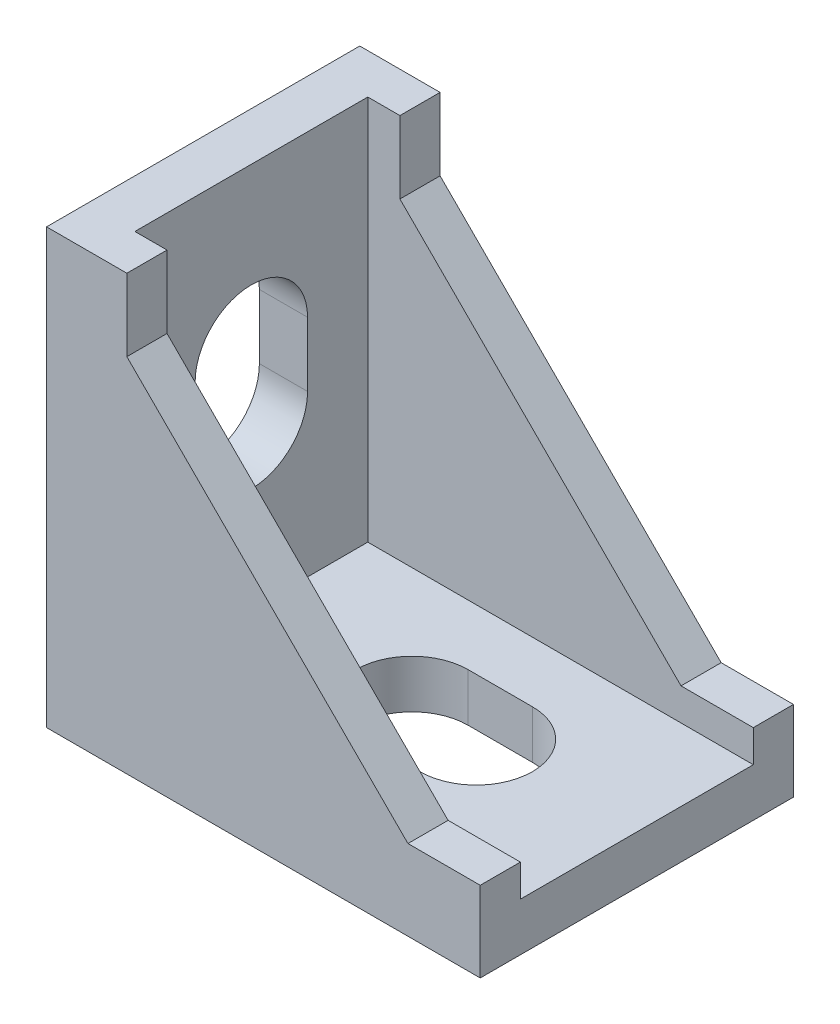
ISO-10303-21;
HEADER;
FILE_DESCRIPTION(('STEP AP214'),'2;1');
FILE_NAME('part.step','',(''),(''),'','','');
FILE_SCHEMA(('AUTOMOTIVE_DESIGN { 1 0 10303 214 1 1 1 1 }'));
ENDSEC;
DATA;
#1=APPLICATION_CONTEXT('core data for automotive mechanical design processes');
#2=APPLICATION_PROTOCOL_DEFINITION('international standard','automotive_design',2000,#1);
#3=PRODUCT_CONTEXT('',#1,'mechanical');
#4=PRODUCT('Part','Part','',(#3));
#5=PRODUCT_RELATED_PRODUCT_CATEGORY('part','',(#4));
#6=PRODUCT_DEFINITION_FORMATION('','',#4);
#7=PRODUCT_DEFINITION_CONTEXT('part definition',#1,'design');
#8=PRODUCT_DEFINITION('design','',#6,#7);
#9=PRODUCT_DEFINITION_SHAPE('','',#8);
#10=(LENGTH_UNIT() NAMED_UNIT(*) SI_UNIT(.MILLI.,.METRE.));
#11=(NAMED_UNIT(*) PLANE_ANGLE_UNIT() SI_UNIT($,.RADIAN.));
#12=(NAMED_UNIT(*) SI_UNIT($,.STERADIAN.) SOLID_ANGLE_UNIT());
#13=UNCERTAINTY_MEASURE_WITH_UNIT(LENGTH_MEASURE(1.E-05),#10,'distance_accuracy_value','');
#14=(GEOMETRIC_REPRESENTATION_CONTEXT(3) GLOBAL_UNCERTAINTY_ASSIGNED_CONTEXT((#13)) GLOBAL_UNIT_ASSIGNED_CONTEXT((#10,
#11,#12)) REPRESENTATION_CONTEXT('',''));
#15=CARTESIAN_POINT('',(0.,0.,0.));
#16=DIRECTION('',(0.,0.,1.));
#17=DIRECTION('',(1.,0.,0.));
#18=AXIS2_PLACEMENT_3D('',#15,#16,#17);
#19=CARTESIAN_POINT('',(27.,5.,19.5));
#20=DIRECTION('',(-1.,0.,0.));
#21=DIRECTION('',(0.,0.,1.));
#22=AXIS2_PLACEMENT_3D('',#19,#20,#21);
#23=PLANE('',#22);
#24=DIRECTION('',(0.,1.,0.));
#25=VECTOR('',#24,1.);
#26=CARTESIAN_POINT('',(27.,3.,2.5));
#27=LINE('',#26,#25);
#28=CARTESIAN_POINT('',(27.,3.,2.5));
#29=VERTEX_POINT('',#28);
#30=CARTESIAN_POINT('',(27.,5.,2.5));
#31=VERTEX_POINT('',#30);
#32=EDGE_CURVE('E259',#29,#31,#27,.T.);
#33=ORIENTED_EDGE('',*,*,#32,.F.);
#34=DIRECTION('',(0.,0.,1.));
#35=VECTOR('',#34,1.);
#36=CARTESIAN_POINT('',(27.,3.,2.5));
#37=LINE('',#36,#35);
#38=CARTESIAN_POINT('',(27.,3.,17.));
#39=VERTEX_POINT('',#38);
#40=EDGE_CURVE('E294',#29,#39,#37,.T.);
#41=ORIENTED_EDGE('',*,*,#40,.T.);
#42=DIRECTION('',(0.,1.,0.));
#43=VECTOR('',#42,1.);
#44=CARTESIAN_POINT('',(27.,3.,17.));
#45=LINE('',#44,#43);
#46=CARTESIAN_POINT('',(27.,5.,17.));
#47=VERTEX_POINT('',#46);
#48=EDGE_CURVE('E276',#39,#47,#45,.T.);
#49=ORIENTED_EDGE('',*,*,#48,.T.);
#50=DIRECTION('',(0.,0.,-1.));
#51=VECTOR('',#50,1.);
#52=CARTESIAN_POINT('',(27.,5.,19.5));
#53=LINE('',#52,#51);
#54=CARTESIAN_POINT('',(27.,5.,19.5));
#55=VERTEX_POINT('',#54);
#56=EDGE_CURVE('E42',#55,#47,#53,.T.);
#57=ORIENTED_EDGE('',*,*,#56,.F.);
#58=DIRECTION('',(0.,1.,0.));
#59=VECTOR('',#58,1.);
#60=CARTESIAN_POINT('',(27.,5.,19.5));
#61=LINE('',#60,#59);
#62=CARTESIAN_POINT('',(27.,0.,19.5));
#63=VERTEX_POINT('',#62);
#64=EDGE_CURVE('E301',#63,#55,#61,.T.);
#65=ORIENTED_EDGE('',*,*,#64,.F.);
#66=DIRECTION('',(0.,0.,-1.));
#67=VECTOR('',#66,1.);
#68=CARTESIAN_POINT('',(27.,0.,19.5));
#69=LINE('',#68,#67);
#70=CARTESIAN_POINT('',(27.,0.,0.));
#71=VERTEX_POINT('',#70);
#72=EDGE_CURVE('E11',#63,#71,#69,.T.);
#73=ORIENTED_EDGE('',*,*,#72,.T.);
#74=DIRECTION('',(0.,1.,0.));
#75=VECTOR('',#74,1.);
#76=CARTESIAN_POINT('',(27.,5.,0.));
#77=LINE('',#76,#75);
#78=CARTESIAN_POINT('',(27.,5.,0.));
#79=VERTEX_POINT('',#78);
#80=EDGE_CURVE('E317',#71,#79,#77,.T.);
#81=ORIENTED_EDGE('',*,*,#80,.T.);
#82=EDGE_CURVE('E348',#31,#79,#53,.T.);
#83=ORIENTED_EDGE('',*,*,#82,.F.);
#84=EDGE_LOOP('',(#33,#41,#49,#57,#65,#73,#81,#83));
#85=FACE_BOUND('',#84,.T.);
#86=ADVANCED_FACE('F34',(#85),#23,.F.);
#87=CARTESIAN_POINT('',(22.5,5.,19.5));
#88=DIRECTION('',(0.,-1.,0.));
#89=DIRECTION('',(0.,0.,-1.));
#90=AXIS2_PLACEMENT_3D('',#87,#88,#89);
#91=PLANE('',#90);
#92=DIRECTION('',(-1.,0.,0.));
#93=VECTOR('',#92,1.);
#94=CARTESIAN_POINT('',(22.5,5.,2.5));
#95=LINE('',#94,#93);
#96=CARTESIAN_POINT('',(22.5,5.,2.5));
#97=VERTEX_POINT('',#96);
#98=EDGE_CURVE('E261',#31,#97,#95,.T.);
#99=ORIENTED_EDGE('',*,*,#98,.F.);
#100=ORIENTED_EDGE('',*,*,#82,.T.);
#101=DIRECTION('',(-1.,0.,0.));
#102=VECTOR('',#101,1.);
#103=CARTESIAN_POINT('',(22.5,5.,0.));
#104=LINE('',#103,#102);
#105=CARTESIAN_POINT('',(22.5,5.,0.));
#106=VERTEX_POINT('',#105);
#107=EDGE_CURVE('E320',#79,#106,#104,.T.);
#108=ORIENTED_EDGE('',*,*,#107,.T.);
#109=DIRECTION('',(0.,0.,-1.));
#110=VECTOR('',#109,1.);
#111=CARTESIAN_POINT('',(22.5,5.,19.5));
#112=LINE('',#111,#110);
#113=EDGE_CURVE('E345',#97,#106,#112,.T.);
#114=ORIENTED_EDGE('',*,*,#113,.F.);
#115=EDGE_LOOP('',(#99,#100,#108,#114));
#116=FACE_BOUND('',#115,.T.);
#117=ADVANCED_FACE('F356',(#116),#91,.F.);
#118=CARTESIAN_POINT('',(5.,22.5,19.5));
#119=DIRECTION('',(-0.707106781186548,-0.707106781186548,0.));
#120=DIRECTION('',(0.707106781186548,-0.707106781186548,0.));
#121=AXIS2_PLACEMENT_3D('',#118,#119,#120);
#122=PLANE('',#121);
#123=DIRECTION('',(-0.707106781186548,0.707106781186548,0.));
#124=VECTOR('',#123,1.);
#125=CARTESIAN_POINT('',(5.,22.5,2.5));
#126=LINE('',#125,#124);
#127=CARTESIAN_POINT('',(5.,22.5,2.5));
#128=VERTEX_POINT('',#127);
#129=EDGE_CURVE('E263',#97,#128,#126,.T.);
#130=ORIENTED_EDGE('',*,*,#129,.F.);
#131=ORIENTED_EDGE('',*,*,#113,.T.);
#132=DIRECTION('',(-0.707106781186548,0.707106781186548,0.));
#133=VECTOR('',#132,1.);
#134=CARTESIAN_POINT('',(5.,22.5,0.));
#135=LINE('',#134,#133);
#136=CARTESIAN_POINT('',(5.,22.5,0.));
#137=VERTEX_POINT('',#136);
#138=EDGE_CURVE('E323',#106,#137,#135,.T.);
#139=ORIENTED_EDGE('',*,*,#138,.T.);
#140=DIRECTION('',(0.,0.,-1.));
#141=VECTOR('',#140,1.);
#142=CARTESIAN_POINT('',(5.,22.5,19.5));
#143=LINE('',#142,#141);
#144=EDGE_CURVE('E341',#128,#137,#143,.T.);
#145=ORIENTED_EDGE('',*,*,#144,.F.);
#146=EDGE_LOOP('',(#130,#131,#139,#145));
#147=FACE_BOUND('',#146,.T.);
#148=ADVANCED_FACE('F371',(#147),#122,.F.);
#149=CARTESIAN_POINT('',(5.,27.,19.5));
#150=DIRECTION('',(-1.,0.,0.));
#151=DIRECTION('',(0.,-1.,0.));
#152=AXIS2_PLACEMENT_3D('',#149,#150,#151);
#153=PLANE('',#152);
#154=DIRECTION('',(0.,1.,0.));
#155=VECTOR('',#154,1.);
#156=CARTESIAN_POINT('',(5.,27.,2.5));
#157=LINE('',#156,#155);
#158=CARTESIAN_POINT('',(5.,27.,2.5));
#159=VERTEX_POINT('',#158);
#160=EDGE_CURVE('E265',#128,#159,#157,.T.);
#161=ORIENTED_EDGE('',*,*,#160,.F.);
#162=ORIENTED_EDGE('',*,*,#144,.T.);
#163=DIRECTION('',(0.,1.,0.));
#164=VECTOR('',#163,1.);
#165=CARTESIAN_POINT('',(5.,27.,0.));
#166=LINE('',#165,#164);
#167=CARTESIAN_POINT('',(5.,27.,0.));
#168=VERTEX_POINT('',#167);
#169=EDGE_CURVE('E326',#137,#168,#166,.T.);
#170=ORIENTED_EDGE('',*,*,#169,.T.);
#171=DIRECTION('',(0.,0.,-1.));
#172=VECTOR('',#171,1.);
#173=CARTESIAN_POINT('',(5.,27.,19.5));
#174=LINE('',#173,#172);
#175=EDGE_CURVE('E337',#159,#168,#174,.T.);
#176=ORIENTED_EDGE('',*,*,#175,.F.);
#177=EDGE_LOOP('',(#161,#162,#170,#176));
#178=FACE_BOUND('',#177,.T.);
#179=ADVANCED_FACE('F378',(#178),#153,.F.);
#180=CARTESIAN_POINT('',(0.,27.,19.5));
#181=DIRECTION('',(0.,-1.,0.));
#182=DIRECTION('',(0.,0.,-1.));
#183=AXIS2_PLACEMENT_3D('',#180,#181,#182);
#184=PLANE('',#183);
#185=DIRECTION('',(-1.,0.,0.));
#186=VECTOR('',#185,1.);
#187=CARTESIAN_POINT('',(3.,27.,2.5));
#188=LINE('',#187,#186);
#189=CARTESIAN_POINT('',(3.,27.,2.5));
#190=VERTEX_POINT('',#189);
#191=EDGE_CURVE('E267',#159,#190,#188,.T.);
#192=ORIENTED_EDGE('',*,*,#191,.F.);
#193=ORIENTED_EDGE('',*,*,#175,.T.);
#194=DIRECTION('',(-1.,0.,0.));
#195=VECTOR('',#194,1.);
#196=CARTESIAN_POINT('',(0.,27.,0.));
#197=LINE('',#196,#195);
#198=CARTESIAN_POINT('',(0.,27.,0.));
#199=VERTEX_POINT('',#198);
#200=EDGE_CURVE('E329',#168,#199,#197,.T.);
#201=ORIENTED_EDGE('',*,*,#200,.T.);
#202=DIRECTION('',(0.,0.,-1.));
#203=VECTOR('',#202,1.);
#204=CARTESIAN_POINT('',(0.,27.,19.5));
#205=LINE('',#204,#203);
#206=CARTESIAN_POINT('',(0.,27.,19.5));
#207=VERTEX_POINT('',#206);
#208=EDGE_CURVE('E334',#207,#199,#205,.T.);
#209=ORIENTED_EDGE('',*,*,#208,.F.);
#210=DIRECTION('',(-1.,0.,0.));
#211=VECTOR('',#210,1.);
#212=CARTESIAN_POINT('',(0.,27.,19.5));
#213=LINE('',#212,#211);
#214=CARTESIAN_POINT('',(5.,27.,19.5));
#215=VERTEX_POINT('',#214);
#216=EDGE_CURVE('E310',#215,#207,#213,.T.);
#217=ORIENTED_EDGE('',*,*,#216,.F.);
#218=CARTESIAN_POINT('',(5.,27.,17.));
#219=VERTEX_POINT('',#218);
#220=EDGE_CURVE('E338',#215,#219,#174,.T.);
#221=ORIENTED_EDGE('',*,*,#220,.T.);
#222=DIRECTION('',(-1.,0.,0.));
#223=VECTOR('',#222,1.);
#224=CARTESIAN_POINT('',(3.,27.,17.));
#225=LINE('',#224,#223);
#226=CARTESIAN_POINT('',(3.,27.,17.));
#227=VERTEX_POINT('',#226);
#228=EDGE_CURVE('E256',#219,#227,#225,.T.);
#229=ORIENTED_EDGE('',*,*,#228,.T.);
#230=DIRECTION('',(0.,0.,1.));
#231=VECTOR('',#230,1.);
#232=CARTESIAN_POINT('',(3.,27.,2.5));
#233=LINE('',#232,#231);
#234=EDGE_CURVE('E290',#190,#227,#233,.T.);
#235=ORIENTED_EDGE('',*,*,#234,.F.);
#236=EDGE_LOOP('',(#192,#193,#201,#209,#217,#221,#229,#235));
#237=FACE_BOUND('',#236,.T.);
#238=ADVANCED_FACE('F380',(#237),#184,.F.);
#239=CARTESIAN_POINT('',(27.,0.,19.5));
#240=DIRECTION('',(0.,1.,0.));
#241=DIRECTION('',(-1.,0.,0.));
#242=AXIS2_PLACEMENT_3D('',#239,#240,#241);
#243=PLANE('',#242);
#244=DIRECTION('',(-1.,0.,0.));
#245=VECTOR('',#244,1.);
#246=CARTESIAN_POINT('',(13.,0.,6.25));
#247=LINE('',#246,#245);
#248=CARTESIAN_POINT('',(17.,0.,6.25));
#249=VERTEX_POINT('',#248);
#250=CARTESIAN_POINT('',(13.,0.,6.25));
#251=VERTEX_POINT('',#250);
#252=EDGE_CURVE('E230',#249,#251,#247,.T.);
#253=ORIENTED_EDGE('',*,*,#252,.T.);
#254=CARTESIAN_POINT('',(13.,0.,9.75));
#255=DIRECTION('',(0.,1.,0.));
#256=DIRECTION('',(0.,0.,1.));
#257=AXIS2_PLACEMENT_3D('',#254,#255,#256);
#258=CIRCLE('',#257,3.5);
#259=CARTESIAN_POINT('',(13.,0.,13.25));
#260=VERTEX_POINT('',#259);
#261=EDGE_CURVE('E220',#251,#260,#258,.T.);
#262=ORIENTED_EDGE('',*,*,#261,.T.);
#263=DIRECTION('',(1.,0.,0.));
#264=VECTOR('',#263,1.);
#265=CARTESIAN_POINT('',(13.,0.,13.25));
#266=LINE('',#265,#264);
#267=CARTESIAN_POINT('',(17.,0.,13.25));
#268=VERTEX_POINT('',#267);
#269=EDGE_CURVE('E223',#260,#268,#266,.T.);
#270=ORIENTED_EDGE('',*,*,#269,.T.);
#271=CARTESIAN_POINT('',(17.,0.,9.75));
#272=DIRECTION('',(0.,1.,0.));
#273=DIRECTION('',(0.,0.,1.));
#274=AXIS2_PLACEMENT_3D('',#271,#272,#273);
#275=CIRCLE('',#274,3.5);
#276=EDGE_CURVE('E227',#268,#249,#275,.T.);
#277=ORIENTED_EDGE('',*,*,#276,.T.);
#278=EDGE_LOOP('',(#253,#262,#270,#277));
#279=FACE_BOUND('',#278,.T.);
#280=DIRECTION('',(1.,0.,0.));
#281=VECTOR('',#280,1.);
#282=CARTESIAN_POINT('',(27.,0.,0.));
#283=LINE('',#282,#281);
#284=CARTESIAN_POINT('',(0.,0.,0.));
#285=VERTEX_POINT('',#284);
#286=EDGE_CURVE('E293',#285,#71,#283,.T.);
#287=ORIENTED_EDGE('',*,*,#286,.T.);
#288=ORIENTED_EDGE('',*,*,#72,.F.);
#289=DIRECTION('',(1.,0.,0.));
#290=VECTOR('',#289,1.);
#291=CARTESIAN_POINT('',(27.,0.,19.5));
#292=LINE('',#291,#290);
#293=CARTESIAN_POINT('',(0.,0.,19.5));
#294=VERTEX_POINT('',#293);
#295=EDGE_CURVE('E298',#294,#63,#292,.T.);
#296=ORIENTED_EDGE('',*,*,#295,.F.);
#297=DIRECTION('',(0.,0.,-1.));
#298=VECTOR('',#297,1.);
#299=CARTESIAN_POINT('',(0.,0.,19.5));
#300=LINE('',#299,#298);
#301=EDGE_CURVE('E314',#294,#285,#300,.T.);
#302=ORIENTED_EDGE('',*,*,#301,.T.);
#303=EDGE_LOOP('',(#287,#288,#296,#302));
#304=FACE_BOUND('',#303,.T.);
#305=ADVANCED_FACE('F36',(#279,#304),#243,.F.);
#306=ORIENTED_EDGE('',*,*,#56,.T.);
#307=DIRECTION('',(-1.,0.,0.));
#308=VECTOR('',#307,1.);
#309=CARTESIAN_POINT('',(22.5,5.,17.));
#310=LINE('',#309,#308);
#311=CARTESIAN_POINT('',(22.5,5.,17.));
#312=VERTEX_POINT('',#311);
#313=EDGE_CURVE('E279',#47,#312,#310,.T.);
#314=ORIENTED_EDGE('',*,*,#313,.T.);
#315=CARTESIAN_POINT('',(22.5,5.,19.5));
#316=VERTEX_POINT('',#315);
#317=EDGE_CURVE('E346',#316,#312,#112,.T.);
#318=ORIENTED_EDGE('',*,*,#317,.F.);
#319=DIRECTION('',(-1.,0.,0.));
#320=VECTOR('',#319,1.);
#321=CARTESIAN_POINT('',(22.5,5.,19.5));
#322=LINE('',#321,#320);
#323=EDGE_CURVE('E304',#55,#316,#322,.T.);
#324=ORIENTED_EDGE('',*,*,#323,.F.);
#325=EDGE_LOOP('',(#306,#314,#318,#324));
#326=FACE_BOUND('',#325,.T.);
#327=ADVANCED_FACE('F392',(#326),#91,.F.);
#328=ORIENTED_EDGE('',*,*,#317,.T.);
#329=DIRECTION('',(-0.707106781186548,0.707106781186548,0.));
#330=VECTOR('',#329,1.);
#331=CARTESIAN_POINT('',(5.,22.5,17.));
#332=LINE('',#331,#330);
#333=CARTESIAN_POINT('',(5.,22.5,17.));
#334=VERTEX_POINT('',#333);
#335=EDGE_CURVE('E282',#312,#334,#332,.T.);
#336=ORIENTED_EDGE('',*,*,#335,.T.);
#337=CARTESIAN_POINT('',(5.,22.5,19.5));
#338=VERTEX_POINT('',#337);
#339=EDGE_CURVE('E342',#338,#334,#143,.T.);
#340=ORIENTED_EDGE('',*,*,#339,.F.);
#341=DIRECTION('',(-0.707106781186548,0.707106781186548,0.));
#342=VECTOR('',#341,1.);
#343=CARTESIAN_POINT('',(5.,22.5,19.5));
#344=LINE('',#343,#342);
#345=EDGE_CURVE('E306',#316,#338,#344,.T.);
#346=ORIENTED_EDGE('',*,*,#345,.F.);
#347=EDGE_LOOP('',(#328,#336,#340,#346));
#348=FACE_BOUND('',#347,.T.);
#349=ADVANCED_FACE('F395',(#348),#122,.F.);
#350=ORIENTED_EDGE('',*,*,#339,.T.);
#351=DIRECTION('',(0.,1.,0.));
#352=VECTOR('',#351,1.);
#353=CARTESIAN_POINT('',(5.,27.,17.));
#354=LINE('',#353,#352);
#355=EDGE_CURVE('E285',#334,#219,#354,.T.);
#356=ORIENTED_EDGE('',*,*,#355,.T.);
#357=ORIENTED_EDGE('',*,*,#220,.F.);
#358=DIRECTION('',(0.,1.,0.));
#359=VECTOR('',#358,1.);
#360=CARTESIAN_POINT('',(5.,27.,19.5));
#361=LINE('',#360,#359);
#362=EDGE_CURVE('E308',#338,#215,#361,.T.);
#363=ORIENTED_EDGE('',*,*,#362,.F.);
#364=EDGE_LOOP('',(#350,#356,#357,#363));
#365=FACE_BOUND('',#364,.T.);
#366=ADVANCED_FACE('F408',(#365),#153,.F.);
#367=CARTESIAN_POINT('',(0.,0.,19.5));
#368=DIRECTION('',(1.,0.,0.));
#369=DIRECTION('',(0.,0.,-1.));
#370=AXIS2_PLACEMENT_3D('',#367,#368,#369);
#371=PLANE('',#370);
#372=DIRECTION('',(0.,-1.,0.));
#373=VECTOR('',#372,1.);
#374=CARTESIAN_POINT('',(0.,13.,13.25));
#375=LINE('',#374,#373);
#376=CARTESIAN_POINT('',(0.,17.,13.25));
#377=VERTEX_POINT('',#376);
#378=CARTESIAN_POINT('',(0.,13.,13.25));
#379=VERTEX_POINT('',#378);
#380=EDGE_CURVE('E191',#377,#379,#375,.T.);
#381=ORIENTED_EDGE('',*,*,#380,.T.);
#382=CARTESIAN_POINT('',(0.,13.,9.75));
#383=DIRECTION('',(1.,0.,0.));
#384=DIRECTION('',(0.,1.,0.));
#385=AXIS2_PLACEMENT_3D('',#382,#383,#384);
#386=CIRCLE('',#385,3.5);
#387=CARTESIAN_POINT('',(0.,13.,6.25));
#388=VERTEX_POINT('',#387);
#389=EDGE_CURVE('E185',#379,#388,#386,.T.);
#390=ORIENTED_EDGE('',*,*,#389,.T.);
#391=DIRECTION('',(0.,1.,0.));
#392=VECTOR('',#391,1.);
#393=CARTESIAN_POINT('',(0.,13.,6.25));
#394=LINE('',#393,#392);
#395=CARTESIAN_POINT('',(0.,17.,6.25));
#396=VERTEX_POINT('',#395);
#397=EDGE_CURVE('E194',#388,#396,#394,.T.);
#398=ORIENTED_EDGE('',*,*,#397,.T.);
#399=CARTESIAN_POINT('',(0.,17.,9.75));
#400=DIRECTION('',(1.,0.,0.));
#401=DIRECTION('',(0.,1.,0.));
#402=AXIS2_PLACEMENT_3D('',#399,#400,#401);
#403=CIRCLE('',#402,3.5);
#404=EDGE_CURVE('E49',#396,#377,#403,.T.);
#405=ORIENTED_EDGE('',*,*,#404,.T.);
#406=EDGE_LOOP('',(#381,#390,#398,#405));
#407=FACE_BOUND('',#406,.T.);
#408=DIRECTION('',(0.,-1.,0.));
#409=VECTOR('',#408,1.);
#410=CARTESIAN_POINT('',(0.,0.,0.));
#411=LINE('',#410,#409);
#412=EDGE_CURVE('E302',#199,#285,#411,.T.);
#413=ORIENTED_EDGE('',*,*,#412,.T.);
#414=ORIENTED_EDGE('',*,*,#301,.F.);
#415=DIRECTION('',(0.,-1.,0.));
#416=VECTOR('',#415,1.);
#417=CARTESIAN_POINT('',(0.,0.,19.5));
#418=LINE('',#417,#416);
#419=EDGE_CURVE('E312',#207,#294,#418,.T.);
#420=ORIENTED_EDGE('',*,*,#419,.F.);
#421=ORIENTED_EDGE('',*,*,#208,.T.);
#422=EDGE_LOOP('',(#413,#414,#420,#421));
#423=FACE_BOUND('',#422,.T.);
#424=ADVANCED_FACE('F198',(#407,#423),#371,.F.);
#425=CARTESIAN_POINT('',(0.,0.,19.5));
#426=DIRECTION('',(0.,0.,-1.));
#427=DIRECTION('',(-1.,0.,0.));
#428=AXIS2_PLACEMENT_3D('',#425,#426,#427);
#429=PLANE('',#428);
#430=ORIENTED_EDGE('',*,*,#295,.T.);
#431=ORIENTED_EDGE('',*,*,#64,.T.);
#432=ORIENTED_EDGE('',*,*,#323,.T.);
#433=ORIENTED_EDGE('',*,*,#345,.T.);
#434=ORIENTED_EDGE('',*,*,#362,.T.);
#435=ORIENTED_EDGE('',*,*,#216,.T.);
#436=ORIENTED_EDGE('',*,*,#419,.T.);
#437=EDGE_LOOP('',(#430,#431,#432,#433,#434,#435,#436));
#438=FACE_BOUND('',#437,.T.);
#439=ADVANCED_FACE('F399',(#438),#429,.F.);
#440=CARTESIAN_POINT('',(0.,0.,0.));
#441=DIRECTION('',(0.,0.,-1.));
#442=DIRECTION('',(-1.,0.,0.));
#443=AXIS2_PLACEMENT_3D('',#440,#441,#442);
#444=PLANE('',#443);
#445=ORIENTED_EDGE('',*,*,#286,.F.);
#446=ORIENTED_EDGE('',*,*,#412,.F.);
#447=ORIENTED_EDGE('',*,*,#200,.F.);
#448=ORIENTED_EDGE('',*,*,#169,.F.);
#449=ORIENTED_EDGE('',*,*,#138,.F.);
#450=ORIENTED_EDGE('',*,*,#107,.F.);
#451=ORIENTED_EDGE('',*,*,#80,.F.);
#452=EDGE_LOOP('',(#445,#446,#447,#448,#449,#450,#451));
#453=FACE_BOUND('',#452,.T.);
#454=ADVANCED_FACE('F365',(#453),#444,.T.);
#455=CARTESIAN_POINT('',(3.,27.,2.5));
#456=DIRECTION('',(-1.,0.,0.));
#457=DIRECTION('',(0.,-1.,0.));
#458=AXIS2_PLACEMENT_3D('',#455,#456,#457);
#459=PLANE('',#458);
#460=DIRECTION('',(0.,1.,0.));
#461=VECTOR('',#460,1.);
#462=CARTESIAN_POINT('',(3.,13.,6.25));
#463=LINE('',#462,#461);
#464=CARTESIAN_POINT('',(3.,13.,6.25));
#465=VERTEX_POINT('',#464);
#466=CARTESIAN_POINT('',(3.,17.,6.25));
#467=VERTEX_POINT('',#466);
#468=EDGE_CURVE('E210',#465,#467,#463,.T.);
#469=ORIENTED_EDGE('',*,*,#468,.F.);
#470=CARTESIAN_POINT('',(3.,13.,9.75));
#471=DIRECTION('',(1.,0.,0.));
#472=DIRECTION('',(0.,1.,0.));
#473=AXIS2_PLACEMENT_3D('',#470,#471,#472);
#474=CIRCLE('',#473,3.5);
#475=CARTESIAN_POINT('',(3.,13.,13.25));
#476=VERTEX_POINT('',#475);
#477=EDGE_CURVE('E57',#476,#465,#474,.T.);
#478=ORIENTED_EDGE('',*,*,#477,.F.);
#479=DIRECTION('',(0.,-1.,0.));
#480=VECTOR('',#479,1.);
#481=CARTESIAN_POINT('',(3.,13.,13.25));
#482=LINE('',#481,#480);
#483=CARTESIAN_POINT('',(3.,17.,13.25));
#484=VERTEX_POINT('',#483);
#485=EDGE_CURVE('E201',#484,#476,#482,.T.);
#486=ORIENTED_EDGE('',*,*,#485,.F.);
#487=CARTESIAN_POINT('',(3.,17.,9.75));
#488=DIRECTION('',(1.,0.,0.));
#489=DIRECTION('',(0.,1.,0.));
#490=AXIS2_PLACEMENT_3D('',#487,#488,#489);
#491=CIRCLE('',#490,3.5);
#492=EDGE_CURVE('E204',#467,#484,#491,.T.);
#493=ORIENTED_EDGE('',*,*,#492,.F.);
#494=EDGE_LOOP('',(#469,#478,#486,#493));
#495=FACE_BOUND('',#494,.T.);
#496=DIRECTION('',(0.,-1.,0.));
#497=VECTOR('',#496,1.);
#498=CARTESIAN_POINT('',(3.,27.,17.));
#499=LINE('',#498,#497);
#500=CARTESIAN_POINT('',(3.,3.,17.));
#501=VERTEX_POINT('',#500);
#502=EDGE_CURVE('E245',#227,#501,#499,.T.);
#503=ORIENTED_EDGE('',*,*,#502,.T.);
#504=DIRECTION('',(0.,0.,1.));
#505=VECTOR('',#504,1.);
#506=CARTESIAN_POINT('',(3.,3.,2.5));
#507=LINE('',#506,#505);
#508=CARTESIAN_POINT('',(3.,3.,2.5));
#509=VERTEX_POINT('',#508);
#510=EDGE_CURVE('E270',#509,#501,#507,.T.);
#511=ORIENTED_EDGE('',*,*,#510,.F.);
#512=DIRECTION('',(0.,-1.,0.));
#513=VECTOR('',#512,1.);
#514=CARTESIAN_POINT('',(3.,27.,2.5));
#515=LINE('',#514,#513);
#516=EDGE_CURVE('E252',#190,#509,#515,.T.);
#517=ORIENTED_EDGE('',*,*,#516,.F.);
#518=ORIENTED_EDGE('',*,*,#234,.T.);
#519=EDGE_LOOP('',(#503,#511,#517,#518));
#520=FACE_BOUND('',#519,.T.);
#521=ADVANCED_FACE('F385',(#495,#520),#459,.F.);
#522=CARTESIAN_POINT('',(3.,3.,2.5));
#523=DIRECTION('',(0.,-1.,0.));
#524=DIRECTION('',(0.,0.,-1.));
#525=AXIS2_PLACEMENT_3D('',#522,#523,#524);
#526=PLANE('',#525);
#527=DIRECTION('',(1.,0.,0.));
#528=VECTOR('',#527,1.);
#529=CARTESIAN_POINT('',(13.,3.,13.25));
#530=LINE('',#529,#528);
#531=CARTESIAN_POINT('',(13.,3.,13.25));
#532=VERTEX_POINT('',#531);
#533=CARTESIAN_POINT('',(17.,3.,13.25));
#534=VERTEX_POINT('',#533);
#535=EDGE_CURVE('E235',#532,#534,#530,.T.);
#536=ORIENTED_EDGE('',*,*,#535,.F.);
#537=CARTESIAN_POINT('',(13.,3.,9.75));
#538=DIRECTION('',(0.,1.,0.));
#539=DIRECTION('',(0.,0.,1.));
#540=AXIS2_PLACEMENT_3D('',#537,#538,#539);
#541=CIRCLE('',#540,3.5);
#542=CARTESIAN_POINT('',(13.,3.,6.25));
#543=VERTEX_POINT('',#542);
#544=EDGE_CURVE('E216',#543,#532,#541,.T.);
#545=ORIENTED_EDGE('',*,*,#544,.F.);
#546=DIRECTION('',(-1.,0.,0.));
#547=VECTOR('',#546,1.);
#548=CARTESIAN_POINT('',(13.,3.,6.25));
#549=LINE('',#548,#547);
#550=CARTESIAN_POINT('',(17.,3.,6.25));
#551=VERTEX_POINT('',#550);
#552=EDGE_CURVE('E224',#551,#543,#549,.T.);
#553=ORIENTED_EDGE('',*,*,#552,.F.);
#554=CARTESIAN_POINT('',(17.,3.,9.75));
#555=DIRECTION('',(0.,1.,0.));
#556=DIRECTION('',(0.,0.,1.));
#557=AXIS2_PLACEMENT_3D('',#554,#555,#556);
#558=CIRCLE('',#557,3.5);
#559=EDGE_CURVE('E238',#534,#551,#558,.T.);
#560=ORIENTED_EDGE('',*,*,#559,.F.);
#561=EDGE_LOOP('',(#536,#545,#553,#560));
#562=FACE_BOUND('',#561,.T.);
#563=DIRECTION('',(1.,0.,0.));
#564=VECTOR('',#563,1.);
#565=CARTESIAN_POINT('',(3.,3.,17.));
#566=LINE('',#565,#564);
#567=EDGE_CURVE('E273',#501,#39,#566,.T.);
#568=ORIENTED_EDGE('',*,*,#567,.T.);
#569=ORIENTED_EDGE('',*,*,#40,.F.);
#570=DIRECTION('',(1.,0.,0.));
#571=VECTOR('',#570,1.);
#572=CARTESIAN_POINT('',(3.,3.,2.5));
#573=LINE('',#572,#571);
#574=EDGE_CURVE('E255',#509,#29,#573,.T.);
#575=ORIENTED_EDGE('',*,*,#574,.F.);
#576=ORIENTED_EDGE('',*,*,#510,.T.);
#577=EDGE_LOOP('',(#568,#569,#575,#576));
#578=FACE_BOUND('',#577,.T.);
#579=ADVANCED_FACE('F388',(#562,#578),#526,.F.);
#580=CARTESIAN_POINT('',(0.,0.,2.5));
#581=DIRECTION('',(0.,0.,1.));
#582=DIRECTION('',(1.,0.,0.));
#583=AXIS2_PLACEMENT_3D('',#580,#581,#582);
#584=PLANE('',#583);
#585=ORIENTED_EDGE('',*,*,#516,.T.);
#586=ORIENTED_EDGE('',*,*,#574,.T.);
#587=ORIENTED_EDGE('',*,*,#32,.T.);
#588=ORIENTED_EDGE('',*,*,#98,.T.);
#589=ORIENTED_EDGE('',*,*,#129,.T.);
#590=ORIENTED_EDGE('',*,*,#160,.T.);
#591=ORIENTED_EDGE('',*,*,#191,.T.);
#592=EDGE_LOOP('',(#585,#586,#587,#588,#589,#590,#591));
#593=FACE_BOUND('',#592,.T.);
#594=ADVANCED_FACE('F374',(#593),#584,.T.);
#595=CARTESIAN_POINT('',(0.,0.,17.));
#596=DIRECTION('',(0.,0.,1.));
#597=DIRECTION('',(1.,0.,0.));
#598=AXIS2_PLACEMENT_3D('',#595,#596,#597);
#599=PLANE('',#598);
#600=ORIENTED_EDGE('',*,*,#502,.F.);
#601=ORIENTED_EDGE('',*,*,#228,.F.);
#602=ORIENTED_EDGE('',*,*,#355,.F.);
#603=ORIENTED_EDGE('',*,*,#335,.F.);
#604=ORIENTED_EDGE('',*,*,#313,.F.);
#605=ORIENTED_EDGE('',*,*,#48,.F.);
#606=ORIENTED_EDGE('',*,*,#567,.F.);
#607=EDGE_LOOP('',(#600,#601,#602,#603,#604,#605,#606));
#608=FACE_BOUND('',#607,.T.);
#609=ADVANCED_FACE('F390',(#608),#599,.F.);
#610=CARTESIAN_POINT('',(13.,0.,9.75));
#611=DIRECTION('',(0.,1.,0.));
#612=DIRECTION('',(0.,0.,1.));
#613=AXIS2_PLACEMENT_3D('',#610,#611,#612);
#614=CYLINDRICAL_SURFACE('',#613,3.5);
#615=ORIENTED_EDGE('',*,*,#544,.T.);
#616=DIRECTION('',(0.,1.,0.));
#617=VECTOR('',#616,1.);
#618=CARTESIAN_POINT('',(13.,0.,13.25));
#619=LINE('',#618,#617);
#620=EDGE_CURVE('E233',#260,#532,#619,.T.);
#621=ORIENTED_EDGE('',*,*,#620,.F.);
#622=ORIENTED_EDGE('',*,*,#261,.F.);
#623=DIRECTION('',(0.,1.,0.));
#624=VECTOR('',#623,1.);
#625=CARTESIAN_POINT('',(13.,0.,6.25));
#626=LINE('',#625,#624);
#627=EDGE_CURVE('E243',#251,#543,#626,.T.);
#628=ORIENTED_EDGE('',*,*,#627,.T.);
#629=EDGE_LOOP('',(#615,#621,#622,#628));
#630=FACE_BOUND('',#629,.T.);
#631=ADVANCED_FACE('F439',(#630),#614,.F.);
#632=CARTESIAN_POINT('',(13.,0.,6.25));
#633=DIRECTION('',(0.,0.,-1.));
#634=DIRECTION('',(-1.,0.,0.));
#635=AXIS2_PLACEMENT_3D('',#632,#633,#634);
#636=PLANE('',#635);
#637=ORIENTED_EDGE('',*,*,#552,.T.);
#638=ORIENTED_EDGE('',*,*,#627,.F.);
#639=ORIENTED_EDGE('',*,*,#252,.F.);
#640=DIRECTION('',(0.,1.,0.));
#641=VECTOR('',#640,1.);
#642=CARTESIAN_POINT('',(17.,0.,6.25));
#643=LINE('',#642,#641);
#644=EDGE_CURVE('E246',#249,#551,#643,.T.);
#645=ORIENTED_EDGE('',*,*,#644,.T.);
#646=EDGE_LOOP('',(#637,#638,#639,#645));
#647=FACE_BOUND('',#646,.T.);
#648=ADVANCED_FACE('F435',(#647),#636,.F.);
#649=CARTESIAN_POINT('',(17.,0.,9.75));
#650=DIRECTION('',(0.,1.,0.));
#651=DIRECTION('',(0.,0.,1.));
#652=AXIS2_PLACEMENT_3D('',#649,#650,#651);
#653=CYLINDRICAL_SURFACE('',#652,3.5);
#654=ORIENTED_EDGE('',*,*,#559,.T.);
#655=ORIENTED_EDGE('',*,*,#644,.F.);
#656=ORIENTED_EDGE('',*,*,#276,.F.);
#657=DIRECTION('',(0.,1.,0.));
#658=VECTOR('',#657,1.);
#659=CARTESIAN_POINT('',(17.,0.,13.25));
#660=LINE('',#659,#658);
#661=EDGE_CURVE('E248',#268,#534,#660,.T.);
#662=ORIENTED_EDGE('',*,*,#661,.T.);
#663=EDGE_LOOP('',(#654,#655,#656,#662));
#664=FACE_BOUND('',#663,.T.);
#665=ADVANCED_FACE('F447',(#664),#653,.F.);
#666=CARTESIAN_POINT('',(13.,0.,13.25));
#667=DIRECTION('',(0.,0.,1.));
#668=DIRECTION('',(1.,0.,0.));
#669=AXIS2_PLACEMENT_3D('',#666,#667,#668);
#670=PLANE('',#669);
#671=ORIENTED_EDGE('',*,*,#535,.T.);
#672=ORIENTED_EDGE('',*,*,#661,.F.);
#673=ORIENTED_EDGE('',*,*,#269,.F.);
#674=ORIENTED_EDGE('',*,*,#620,.T.);
#675=EDGE_LOOP('',(#671,#672,#673,#674));
#676=FACE_BOUND('',#675,.T.);
#677=ADVANCED_FACE('F444',(#676),#670,.F.);
#678=CARTESIAN_POINT('',(0.,13.,9.75));
#679=DIRECTION('',(1.,0.,0.));
#680=DIRECTION('',(0.,1.,0.));
#681=AXIS2_PLACEMENT_3D('',#678,#679,#680);
#682=CYLINDRICAL_SURFACE('',#681,3.5);
#683=ORIENTED_EDGE('',*,*,#477,.T.);
#684=DIRECTION('',(1.,0.,0.));
#685=VECTOR('',#684,1.);
#686=CARTESIAN_POINT('',(0.,13.,6.25));
#687=LINE('',#686,#685);
#688=EDGE_CURVE('E181',#388,#465,#687,.T.);
#689=ORIENTED_EDGE('',*,*,#688,.F.);
#690=ORIENTED_EDGE('',*,*,#389,.F.);
#691=DIRECTION('',(1.,0.,0.));
#692=VECTOR('',#691,1.);
#693=CARTESIAN_POINT('',(0.,13.,13.25));
#694=LINE('',#693,#692);
#695=EDGE_CURVE('E214',#379,#476,#694,.T.);
#696=ORIENTED_EDGE('',*,*,#695,.T.);
#697=EDGE_LOOP('',(#683,#689,#690,#696));
#698=FACE_BOUND('',#697,.T.);
#699=ADVANCED_FACE('F183',(#698),#682,.F.);
#700=CARTESIAN_POINT('',(0.,13.,13.25));
#701=DIRECTION('',(0.,0.,1.));
#702=DIRECTION('',(1.,0.,0.));
#703=AXIS2_PLACEMENT_3D('',#700,#701,#702);
#704=PLANE('',#703);
#705=ORIENTED_EDGE('',*,*,#485,.T.);
#706=ORIENTED_EDGE('',*,*,#695,.F.);
#707=ORIENTED_EDGE('',*,*,#380,.F.);
#708=DIRECTION('',(1.,0.,0.));
#709=VECTOR('',#708,1.);
#710=CARTESIAN_POINT('',(0.,17.,13.25));
#711=LINE('',#710,#709);
#712=EDGE_CURVE('E217',#377,#484,#711,.T.);
#713=ORIENTED_EDGE('',*,*,#712,.T.);
#714=EDGE_LOOP('',(#705,#706,#707,#713));
#715=FACE_BOUND('',#714,.T.);
#716=ADVANCED_FACE('F486',(#715),#704,.F.);
#717=CARTESIAN_POINT('',(0.,17.,9.75));
#718=DIRECTION('',(1.,0.,0.));
#719=DIRECTION('',(0.,1.,0.));
#720=AXIS2_PLACEMENT_3D('',#717,#718,#719);
#721=CYLINDRICAL_SURFACE('',#720,3.5);
#722=ORIENTED_EDGE('',*,*,#492,.T.);
#723=ORIENTED_EDGE('',*,*,#712,.F.);
#724=ORIENTED_EDGE('',*,*,#404,.F.);
#725=DIRECTION('',(1.,0.,0.));
#726=VECTOR('',#725,1.);
#727=CARTESIAN_POINT('',(0.,17.,6.25));
#728=LINE('',#727,#726);
#729=EDGE_CURVE('E190',#396,#467,#728,.T.);
#730=ORIENTED_EDGE('',*,*,#729,.T.);
#731=EDGE_LOOP('',(#722,#723,#724,#730));
#732=FACE_BOUND('',#731,.T.);
#733=ADVANCED_FACE('F497',(#732),#721,.F.);
#734=CARTESIAN_POINT('',(0.,13.,6.25));
#735=DIRECTION('',(0.,0.,-1.));
#736=DIRECTION('',(0.,1.,0.));
#737=AXIS2_PLACEMENT_3D('',#734,#735,#736);
#738=PLANE('',#737);
#739=ORIENTED_EDGE('',*,*,#468,.T.);
#740=ORIENTED_EDGE('',*,*,#729,.F.);
#741=ORIENTED_EDGE('',*,*,#397,.F.);
#742=ORIENTED_EDGE('',*,*,#688,.T.);
#743=EDGE_LOOP('',(#739,#740,#741,#742));
#744=FACE_BOUND('',#743,.T.);
#745=ADVANCED_FACE('F195',(#744),#738,.F.);
#746=CLOSED_SHELL('',(#86,#117,#148,#179,#238,#305,#327,#349,#366,#424,#439,#454,#521,#579,#594,
#609,#631,#648,#665,#677,#699,#716,#733,#745));
#747=MANIFOLD_SOLID_BREP('B2',#746);
#748=ADVANCED_BREP_SHAPE_REPRESENTATION('',(#18,#747),#14);
#749=SHAPE_DEFINITION_REPRESENTATION(#9,#748);
ENDSEC;
END-ISO-10303-21;
